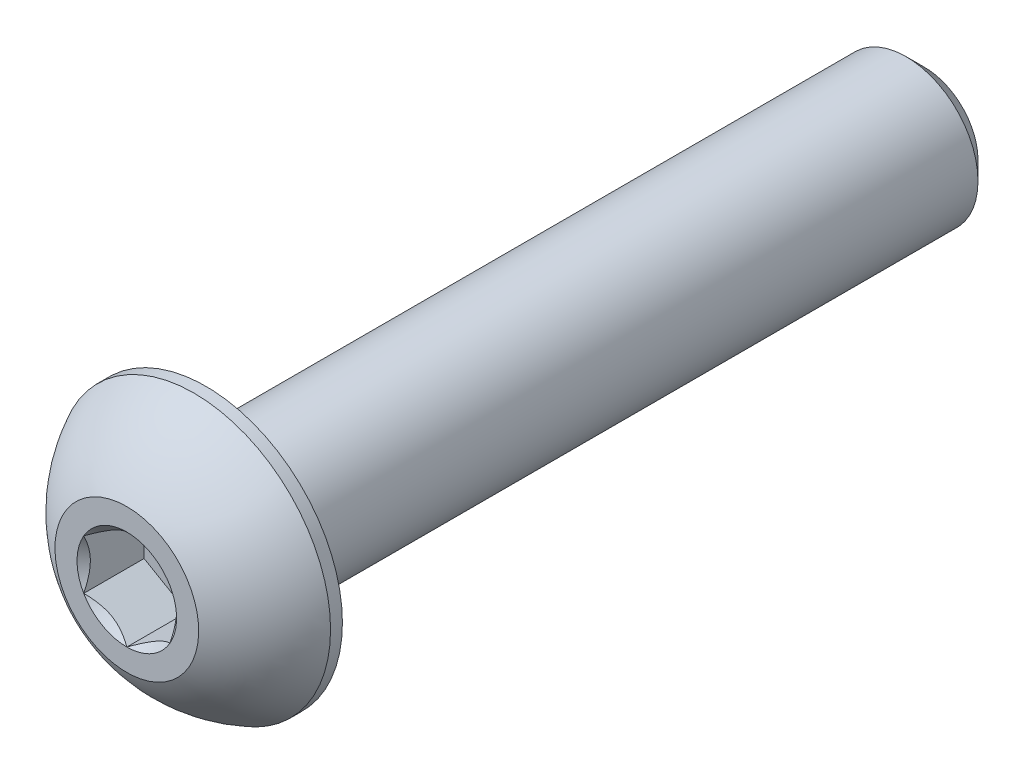
ISO-10303-21;
HEADER;
FILE_DESCRIPTION(('STEP AP214'),'2;1');
FILE_NAME('part.step','',(''),(''),'','','');
FILE_SCHEMA(('AUTOMOTIVE_DESIGN { 1 0 10303 214 1 1 1 1 }'));
ENDSEC;
DATA;
#1=APPLICATION_CONTEXT('core data for automotive mechanical design processes');
#2=APPLICATION_PROTOCOL_DEFINITION('international standard','automotive_design',2000,#1);
#3=PRODUCT_CONTEXT('',#1,'mechanical');
#4=PRODUCT('Part','Part','',(#3));
#5=PRODUCT_RELATED_PRODUCT_CATEGORY('part','',(#4));
#6=PRODUCT_DEFINITION_FORMATION('','',#4);
#7=PRODUCT_DEFINITION_CONTEXT('part definition',#1,'design');
#8=PRODUCT_DEFINITION('design','',#6,#7);
#9=PRODUCT_DEFINITION_SHAPE('','',#8);
#10=(LENGTH_UNIT() NAMED_UNIT(*) SI_UNIT(.MILLI.,.METRE.));
#11=(NAMED_UNIT(*) PLANE_ANGLE_UNIT() SI_UNIT($,.RADIAN.));
#12=(NAMED_UNIT(*) SI_UNIT($,.STERADIAN.) SOLID_ANGLE_UNIT());
#13=UNCERTAINTY_MEASURE_WITH_UNIT(LENGTH_MEASURE(1.E-05),#10,'distance_accuracy_value','');
#14=(GEOMETRIC_REPRESENTATION_CONTEXT(3) GLOBAL_UNCERTAINTY_ASSIGNED_CONTEXT((#13)) GLOBAL_UNIT_ASSIGNED_CONTEXT((#10,
#11,#12)) REPRESENTATION_CONTEXT('',''));
#15=CARTESIAN_POINT('',(0.,0.,0.));
#16=DIRECTION('',(0.,0.,1.));
#17=DIRECTION('',(1.,0.,0.));
#18=AXIS2_PLACEMENT_3D('',#15,#16,#17);
#19=CARTESIAN_POINT('',(0.,0.,13.875));
#20=DIRECTION('',(0.,0.,-1.));
#21=DIRECTION('',(-1.,0.,0.));
#22=AXIS2_PLACEMENT_3D('',#19,#20,#21);
#23=PLANE('',#22);
#24=CARTESIAN_POINT('',(0.,0.,13.875));
#25=DIRECTION('',(0.,0.,1.));
#26=DIRECTION('',(1.,0.,0.));
#27=AXIS2_PLACEMENT_3D('',#24,#25,#26);
#28=CIRCLE('',#27,1.73205080756888);
#29=CARTESIAN_POINT('',(-1.5,0.86602540378444,13.875));
#30=VERTEX_POINT('',#29);
#31=CARTESIAN_POINT('',(-1.5,-0.866025403784439,13.875));
#32=VERTEX_POINT('',#31);
#33=EDGE_CURVE('E138',#30,#32,#28,.T.);
#34=ORIENTED_EDGE('',*,*,#33,.F.);
#35=CARTESIAN_POINT('',(0.,1.73205080756888,13.875));
#36=VERTEX_POINT('',#35);
#37=EDGE_CURVE('E108',#36,#30,#28,.T.);
#38=ORIENTED_EDGE('',*,*,#37,.F.);
#39=CARTESIAN_POINT('',(1.5,0.866025403784439,13.875));
#40=VERTEX_POINT('',#39);
#41=EDGE_CURVE('E98',#40,#36,#28,.T.);
#42=ORIENTED_EDGE('',*,*,#41,.F.);
#43=CARTESIAN_POINT('',(1.5,-0.866025403784438,13.875));
#44=VERTEX_POINT('',#43);
#45=EDGE_CURVE('E59',#44,#40,#28,.T.);
#46=ORIENTED_EDGE('',*,*,#45,.F.);
#47=CARTESIAN_POINT('',(0.,-1.73205080756888,13.875));
#48=VERTEX_POINT('',#47);
#49=EDGE_CURVE('E66',#48,#44,#28,.T.);
#50=ORIENTED_EDGE('',*,*,#49,.F.);
#51=EDGE_CURVE('E141',#32,#48,#28,.T.);
#52=ORIENTED_EDGE('',*,*,#51,.F.);
#53=EDGE_LOOP('',(#34,#38,#42,#46,#50,#52));
#54=FACE_BOUND('',#53,.T.);
#55=CARTESIAN_POINT('',(0.,0.,13.875));
#56=DIRECTION('',(0.,0.,1.));
#57=DIRECTION('',(1.,0.,0.));
#58=AXIS2_PLACEMENT_3D('',#55,#56,#57);
#59=CIRCLE('',#58,2.49999999999999);
#60=CARTESIAN_POINT('',(0.,2.5,13.875));
#61=VERTEX_POINT('',#60);
#62=EDGE_CURVE('E53',#61,#61,#59,.T.);
#63=ORIENTED_EDGE('',*,*,#62,.T.);
#64=EDGE_LOOP('',(#63));
#65=FACE_BOUND('',#64,.T.);
#66=ADVANCED_FACE('F39',(#54,#65),#23,.F.);
#67=CARTESIAN_POINT('',(0.,0.,9.21694518716577));
#68=DIRECTION('',(0.,0.,1.));
#69=DIRECTION('',(0.,1.,0.));
#70=AXIS2_PLACEMENT_3D('',#67,#68,#69);
#71=SPHERICAL_SURFACE('',#70,5.28653711226622);
#72=CARTESIAN_POINT('',(0.,0.,11.5375));
#73=DIRECTION('',(0.,0.,1.));
#74=DIRECTION('',(1.,0.,0.));
#75=AXIS2_PLACEMENT_3D('',#72,#73,#74);
#76=CIRCLE('',#75,4.75);
#77=CARTESIAN_POINT('',(0.,4.75,11.5375));
#78=VERTEX_POINT('',#77);
#79=EDGE_CURVE('E239',#78,#78,#76,.T.);
#80=CARTESIAN_POINT('',(0.,2.5,13.875));
#81=CARTESIAN_POINT('',(0.,2.53026679982017,13.8587557175444));
#82=CARTESIAN_POINT('',(0.,2.56037522904967,13.8422163587936));
#83=CARTESIAN_POINT('',(0.,2.62026400427657,13.8085539481178));
#84=CARTESIAN_POINT('',(0.,2.65004435027396,13.7914308961928));
#85=CARTESIAN_POINT('',(0.,2.70926561698583,13.756607558585));
#86=CARTESIAN_POINT('',(0.,2.73870653770032,13.7389072729021));
#87=CARTESIAN_POINT('',(0.,2.79723777417103,13.7029362059551));
#88=CARTESIAN_POINT('',(0.,2.82632808992725,13.684665424691));
#89=CARTESIAN_POINT('',(0.,2.88414706107589,13.6475603056073));
#90=CARTESIAN_POINT('',(0.,2.91287571646831,13.6287259677878));
#91=CARTESIAN_POINT('',(0.,2.96996045130293,13.5905008930214));
#92=CARTESIAN_POINT('',(0.,2.99831653074514,13.5711101560746));
#93=CARTESIAN_POINT('',(0.,3.05464533901891,13.5317796507551));
#94=CARTESIAN_POINT('',(0.,3.08261806785047,13.5118398823824));
#95=CARTESIAN_POINT('',(0.,3.13816954607726,13.4714188908354));
#96=CARTESIAN_POINT('',(0.,3.1657482954725,13.4509376676611));
#97=CARTESIAN_POINT('',(0.,3.22050133565614,13.409441548791));
#98=CARTESIAN_POINT('',(0.,3.24767562644455,13.3884266530951));
#99=CARTESIAN_POINT('',(0.,3.30160942393942,13.3458711742648));
#100=CARTESIAN_POINT('',(0.,3.32836893064588,13.3243305911303));
#101=CARTESIAN_POINT('',(0.,3.38146299210494,13.2807319222463));
#102=CARTESIAN_POINT('',(0.,3.40779754685753,13.2586738364968));
#103=CARTESIAN_POINT('',(0.,3.46003169800773,13.2140485438445));
#104=CARTESIAN_POINT('',(0.,3.48593129440535,13.1914813369418));
#105=CARTESIAN_POINT('',(0.,3.53728568771641,13.1458463768965));
#106=CARTESIAN_POINT('',(0.,3.56274048462986,13.1227786237539));
#107=CARTESIAN_POINT('',(0.,3.61319560685493,13.0761513363362));
#108=CARTESIAN_POINT('',(0.,3.63819593216655,13.052591802061));
#109=CARTESIAN_POINT('',(0.,3.68773261175691,13.0049899043484));
#110=CARTESIAN_POINT('',(0.,3.71226896603565,12.980947540911));
#111=CARTESIAN_POINT('',(0.,3.76086838042534,12.9323891203059));
#112=CARTESIAN_POINT('',(0.,3.78493144053629,12.9078730631382));
#113=CARTESIAN_POINT('',(0.,3.83257512329416,12.8583765704953));
#114=CARTESIAN_POINT('',(0.,3.85615574594108,12.8333961350201));
#115=CARTESIAN_POINT('',(0.,3.90282559378753,12.7829803776354));
#116=CARTESIAN_POINT('',(0.,3.92591481898706,12.757545055726));
#117=CARTESIAN_POINT('',(0.,3.97159309867276,12.7062291901907));
#118=CARTESIAN_POINT('',(0.,3.99418215315894,12.6803486465648));
#119=CARTESIAN_POINT('',(0.,4.03885150820303,12.6281521714863));
#120=CARTESIAN_POINT('',(0.,4.06093180876093,12.6018362400336));
#121=CARTESIAN_POINT('',(0.,4.10457526604591,12.5487789886263));
#122=CARTESIAN_POINT('',(0.,4.12613842277298,12.5220376686717));
#123=CARTESIAN_POINT('',(0.,4.16873939899417,12.4681398012215));
#124=CARTESIAN_POINT('',(0.,4.1897772184883,12.4409832537258));
#125=CARTESIAN_POINT('',(0.,4.23131952645464,12.386265249929));
#126=CARTESIAN_POINT('',(0.,4.25182401492686,12.3587037936279));
#127=CARTESIAN_POINT('',(0.,4.29229186971308,12.3031864448106));
#128=CARTESIAN_POINT('',(0.,4.31225523602708,12.2752305522945));
#129=CARTESIAN_POINT('',(0.,4.35163326096594,12.2189349535096));
#130=CARTESIAN_POINT('',(0.,4.3710479195908,12.1905952472408));
#131=CARTESIAN_POINT('',(0.,4.40932115213664,12.1335427892629));
#132=CARTESIAN_POINT('',(0.,4.42817972605763,12.1048300375538));
#133=CARTESIAN_POINT('',(0.,4.46533362339398,12.0470423987117));
#134=CARTESIAN_POINT('',(0.,4.48362894680934,12.0179675115786));
#135=CARTESIAN_POINT('',(0.,4.51964939166499,11.9594666496668));
#136=CARTESIAN_POINT('',(0.,4.53737451310527,11.9300406748879));
#137=CARTESIAN_POINT('',(0.,4.57224781803529,11.8708488182676));
#138=CARTESIAN_POINT('',(0.,4.58939600152503,11.8410829364262));
#139=CARTESIAN_POINT('',(0.,4.62310891815402,11.7812225776529));
#140=CARTESIAN_POINT('',(0.,4.63967365129327,11.7511281007211));
#141=CARTESIAN_POINT('',(0.,4.67221336026297,11.6906219802598));
#142=CARTESIAN_POINT('',(0.,4.68818833609342,11.6602103367303));
#143=CARTESIAN_POINT('',(0.,4.71954250823692,11.5990814631935));
#144=CARTESIAN_POINT('',(0.,4.73492170454996,11.5683642331862));
#145=CARTESIAN_POINT('',(0.,4.75,11.5375));
#146=B_SPLINE_CURVE_WITH_KNOTS('',3,(#80,#81,#82,#83,#84,#85,#86,#87,#88,#89,#90,#91,#92,#93,
#94,#95,#96,#97,#98,#99,#100,#101,#102,#103,#104,#105,#106,#107,#108,#109,#110,#111,#112,#113,
#114,#115,#116,#117,#118,#119,#120,#121,#122,#123,#124,#125,#126,#127,#128,#129,#130,#131,#132,
#133,#134,#135,#136,#137,#138,#139,#140,#141,#142,#143,#144,#145),.UNSPECIFIED.,.F.,.F.,(4,2,2,
2,2,2,2,2,2,2,2,2,2,2,2,2,2,2,2,2,2,2,2,2,2,2,2,2,2,2,2,2,4),(0.,0.10304982363783,
0.206099647275662,0.309149470913491,0.412199294551322,0.515249118189152,0.618298941826984,
0.721348765464813,0.824398589102644,0.927448412740474,1.0304982363783,1.13354806001614,
1.23659788365397,1.3396477072918,1.44269753092963,1.54574735456746,1.64879717820529,
1.75184700184312,1.85489682548095,1.95794664911878,2.06099647275661,2.16404629639444,
2.26709612003227,2.3701459436701,2.47319576730793,2.57624559094576,2.67929541458359,
2.78234523822142,2.88539506185925,2.98844488549708,3.09149470913491,3.19454453277274,
3.29759435641057),.UNSPECIFIED.);
#147=EDGE_CURVE('BSEAM246',#61,#78,#146,.T.);
#148=ORIENTED_EDGE('',*,*,#62,.F.);
#149=ORIENTED_EDGE('',*,*,#79,.T.);
#150=ORIENTED_EDGE('',*,*,#147,.T.);
#151=ORIENTED_EDGE('',*,*,#147,.F.);
#152=EDGE_LOOP('',(#148,#150,#149,#151));
#153=FACE_BOUND('',#152,.T.);
#154=ADVANCED_FACE('F246',(#153),#71,.T.);
#155=CARTESIAN_POINT('',(0.,0.,13.875));
#156=DIRECTION('',(0.,0.,1.));
#157=DIRECTION('',(1.,0.,0.));
#158=AXIS2_PLACEMENT_3D('',#155,#156,#157);
#159=CYLINDRICAL_SURFACE('',#158,4.75);
#160=ORIENTED_EDGE('',*,*,#79,.F.);
#161=EDGE_LOOP('',(#160));
#162=FACE_BOUND('',#161,.T.);
#163=CARTESIAN_POINT('',(0.,0.,11.125));
#164=DIRECTION('',(0.,0.,1.));
#165=DIRECTION('',(1.,0.,0.));
#166=AXIS2_PLACEMENT_3D('',#163,#164,#165);
#167=CIRCLE('',#166,4.75);
#168=CARTESIAN_POINT('',(4.75,0.,11.125));
#169=VERTEX_POINT('',#168);
#170=EDGE_CURVE('E235',#169,#169,#167,.T.);
#171=ORIENTED_EDGE('',*,*,#170,.T.);
#172=EDGE_LOOP('',(#171));
#173=FACE_BOUND('',#172,.T.);
#174=ADVANCED_FACE('F249',(#162,#173),#159,.T.);
#175=CARTESIAN_POINT('',(0.,2.49999999999999,11.125));
#176=DIRECTION('',(0.,0.,1.));
#177=DIRECTION('',(1.,0.,0.));
#178=AXIS2_PLACEMENT_3D('',#175,#176,#177);
#179=PLANE('',#178);
#180=ORIENTED_EDGE('',*,*,#170,.F.);
#181=EDGE_LOOP('',(#180));
#182=FACE_BOUND('',#181,.T.);
#183=CARTESIAN_POINT('',(0.,0.,11.125));
#184=DIRECTION('',(0.,0.,1.));
#185=DIRECTION('',(1.,0.,0.));
#186=AXIS2_PLACEMENT_3D('',#183,#184,#185);
#187=CIRCLE('',#186,2.49999999999999);
#188=CARTESIAN_POINT('',(2.49999999999999,0.,11.125));
#189=VERTEX_POINT('',#188);
#190=EDGE_CURVE('E231',#189,#189,#187,.T.);
#191=ORIENTED_EDGE('',*,*,#190,.T.);
#192=EDGE_LOOP('',(#191));
#193=FACE_BOUND('',#192,.T.);
#194=ADVANCED_FACE('F254',(#182,#193),#179,.F.);
#195=CARTESIAN_POINT('',(0.,0.,13.875));
#196=DIRECTION('',(0.,0.,1.));
#197=DIRECTION('',(1.,0.,0.));
#198=AXIS2_PLACEMENT_3D('',#195,#196,#197);
#199=CYLINDRICAL_SURFACE('',#198,2.49999999999999);
#200=ORIENTED_EDGE('',*,*,#190,.F.);
#201=EDGE_LOOP('',(#200));
#202=FACE_BOUND('',#201,.T.);
#203=CARTESIAN_POINT('',(0.,0.,-13.235));
#204=DIRECTION('',(0.,0.,1.));
#205=DIRECTION('',(1.,0.,0.));
#206=AXIS2_PLACEMENT_3D('',#203,#204,#205);
#207=CIRCLE('',#206,2.49999999999999);
#208=CARTESIAN_POINT('',(2.49999999999999,0.,-13.235));
#209=VERTEX_POINT('',#208);
#210=EDGE_CURVE('E227',#209,#209,#207,.T.);
#211=ORIENTED_EDGE('',*,*,#210,.T.);
#212=EDGE_LOOP('',(#211));
#213=FACE_BOUND('',#212,.T.);
#214=ADVANCED_FACE('F260',(#202,#213),#199,.T.);
#215=CARTESIAN_POINT('',(0.,0.,-13.875));
#216=DIRECTION('',(0.,0.,1.));
#217=DIRECTION('',(1.,0.,0.));
#218=AXIS2_PLACEMENT_3D('',#215,#216,#217);
#219=CONICAL_SURFACE('',#218,1.86,0.785398163397444);
#220=ORIENTED_EDGE('',*,*,#210,.F.);
#221=EDGE_LOOP('',(#220));
#222=FACE_BOUND('',#221,.T.);
#223=CARTESIAN_POINT('',(0.,0.,-13.875));
#224=DIRECTION('',(0.,0.,1.));
#225=DIRECTION('',(1.,0.,0.));
#226=AXIS2_PLACEMENT_3D('',#223,#224,#225);
#227=CIRCLE('',#226,1.86);
#228=CARTESIAN_POINT('',(1.86,0.,-13.875));
#229=VERTEX_POINT('',#228);
#230=EDGE_CURVE('E209',#229,#229,#227,.T.);
#231=ORIENTED_EDGE('',*,*,#230,.T.);
#232=EDGE_LOOP('',(#231));
#233=FACE_BOUND('',#232,.T.);
#234=ADVANCED_FACE('F266',(#222,#233),#219,.T.);
#235=CARTESIAN_POINT('',(0.,0.,-13.875));
#236=DIRECTION('',(0.,0.,1.));
#237=DIRECTION('',(1.,0.,0.));
#238=AXIS2_PLACEMENT_3D('',#235,#236,#237);
#239=PLANE('',#238);
#240=ORIENTED_EDGE('',*,*,#230,.F.);
#241=EDGE_LOOP('',(#240));
#242=FACE_BOUND('',#241,.T.);
#243=ADVANCED_FACE('F175',(#242),#239,.F.);
#244=CARTESIAN_POINT('',(0.,0.,13.875));
#245=DIRECTION('',(0.,0.,1.));
#246=DIRECTION('',(1.,0.,0.));
#247=AXIS2_PLACEMENT_3D('',#244,#245,#246);
#248=CONICAL_SURFACE('',#247,1.73205080756888,0.78539816339745);
#249=ORIENTED_EDGE('',*,*,#37,.T.);
#250=CARTESIAN_POINT('',(0.000200000000000348,1.73216627762272,13.8751154816001));
#251=CARTESIAN_POINT('',(-0.0513677907370757,1.70239359975915,13.8453654760673));
#252=CARTESIAN_POINT('',(-0.103797917665201,1.67212305186355,13.8173624839103));
#253=CARTESIAN_POINT('',(-0.210709034055597,1.61039789003619,13.7660892304401));
#254=CARTESIAN_POINT('',(-0.265200195814661,1.57893740312614,13.7428475050444));
#255=CARTESIAN_POINT('',(-0.375079081357248,1.51549879897987,13.7030337289922));
#256=CARTESIAN_POINT('',(-0.4304388090952,1.4835368452681,13.6863615856709));
#257=CARTESIAN_POINT('',(-0.542377257477151,1.41890915196211,13.6606744568181));
#258=CARTESIAN_POINT('',(-0.598952556553008,1.38624538781118,13.6516402904789));
#259=CARTESIAN_POINT('',(-0.696455389516441,1.329952100953,13.6434890812269));
#260=CARTESIAN_POINT('',(-0.737256908280466,1.30639533311124,13.6422822529892));
#261=CARTESIAN_POINT('',(-0.818787969615858,1.25932335290194,13.6443140571623));
#262=CARTESIAN_POINT('',(-0.85951749431463,1.23580815085313,13.6475536707483));
#263=CARTESIAN_POINT('',(-0.940584402163416,1.18900414978427,13.658291985982));
#264=CARTESIAN_POINT('',(-0.980921384598288,1.1657155821172,13.6657946530187));
#265=CARTESIAN_POINT('',(-1.06091833691403,1.11952932016335,13.6846516119283));
#266=CARTESIAN_POINT('',(-1.10057800851621,1.09663179808786,13.6960075570186));
#267=CARTESIAN_POINT('',(-1.20216313477449,1.03798159809698,13.7297216475927));
#268=CARTESIAN_POINT('',(-1.26345855370969,1.00259267147465,13.7546218490934));
#269=CARTESIAN_POINT('',(-1.35358562846331,0.950557780604375,13.7966566532716));
#270=CARTESIAN_POINT('',(-1.38328513990772,0.933410759677148,13.8114251535591));
#271=CARTESIAN_POINT('',(-1.44213790138375,0.899432101996407,13.8423105659402));
#272=CARTESIAN_POINT('',(-1.47129140422064,0.882600319285711,13.8584268341217));
#273=CARTESIAN_POINT('',(-1.5002,0.865909933730602,13.8751154816001));
#274=B_SPLINE_CURVE_WITH_KNOTS('',3,(#250,#251,#252,#253,#254,#255,#256,#257,#258,#259,#260,
#261,#262,#263,#264,#265,#266,#267,#268,#269,#270,#271,#272,#273),.UNSPECIFIED.,.F.,.F.,(4,2,2,
2,2,2,2,2,2,2,2,4),(0.,0.199829143693305,0.400822987382389,0.598623720538181,0.795926240188889,
0.937113067959881,1.07833105577193,1.21968061668222,1.36109089931054,1.58570969637566,
1.69770705470964,1.80965120737194),.UNSPECIFIED.);
#275=EDGE_CURVE('E11',#36,#30,#274,.T.);
#276=ORIENTED_EDGE('',*,*,#275,.F.);
#277=EDGE_LOOP('',(#249,#276));
#278=FACE_BOUND('',#277,.T.);
#279=ADVANCED_FACE('F112',(#278),#248,.F.);
#280=ORIENTED_EDGE('',*,*,#33,.T.);
#281=CARTESIAN_POINT('',(-1.5,-1.72720812969692,14.4305785162708));
#282=CARTESIAN_POINT('',(-1.5,-1.68515175699268,14.3988299078574));
#283=CARTESIAN_POINT('',(-1.5,-1.64286104748673,14.3673925938074));
#284=CARTESIAN_POINT('',(-1.5,-1.55771581035942,14.3052690875564));
#285=CARTESIAN_POINT('',(-1.5,-1.51486114386668,14.2745830858922));
#286=CARTESIAN_POINT('',(-1.5,-1.3846813415127,14.1834071924272));
#287=CARTESIAN_POINT('',(-1.5,-1.29637976071653,14.1242883434268));
#288=CARTESIAN_POINT('',(-1.5,-1.11121478730467,14.0082309963165));
#289=CARTESIAN_POINT('',(-1.5,-1.01415038238167,13.951609558733));
#290=CARTESIAN_POINT('',(-1.5,-0.815173408897604,13.8480368812657));
#291=CARTESIAN_POINT('',(-1.5,-0.713278669253284,13.8010530415417));
#292=CARTESIAN_POINT('',(-1.5,-0.560333774943111,13.7435726684308));
#293=CARTESIAN_POINT('',(-1.5,-0.511547982948041,13.7270753877572));
#294=CARTESIAN_POINT('',(-1.5,-0.412798620136866,13.697997512927));
#295=CARTESIAN_POINT('',(-1.5,-0.362834968437562,13.685417188594));
#296=CARTESIAN_POINT('',(-1.5,-0.262863235444981,13.6650361941468));
#297=CARTESIAN_POINT('',(-1.5,-0.212872113808022,13.657153632746));
#298=CARTESIAN_POINT('',(-1.5,-0.112355243569545,13.646322063969));
#299=CARTESIAN_POINT('',(-1.5,-0.0618295883726279,13.6433722085244));
#300=CARTESIAN_POINT('',(-1.5,0.0374291733323841,13.6426248577249));
#301=CARTESIAN_POINT('',(-1.5,0.0861609672002991,13.6446447335581));
#302=CARTESIAN_POINT('',(-1.5,0.183206937768827,13.6533225528968));
#303=CARTESIAN_POINT('',(-1.5,0.231521073438269,13.6599809469685));
#304=CARTESIAN_POINT('',(-1.5,0.328199853425436,13.6776852441226));
#305=CARTESIAN_POINT('',(-1.5,0.376550616310328,13.688805811257));
#306=CARTESIAN_POINT('',(-1.5,0.472195697125598,13.7148434140487));
#307=CARTESIAN_POINT('',(-1.5,0.519490103092741,13.7297601320409));
#308=CARTESIAN_POINT('',(-1.5,0.668391282696625,13.7823352235961));
#309=CARTESIAN_POINT('',(-1.5,0.767878709508553,13.825981287472));
#310=CARTESIAN_POINT('',(-1.5,0.962179866690724,13.9230229945931));
#311=CARTESIAN_POINT('',(-1.5,1.05697519961444,13.9764536650895));
#312=CARTESIAN_POINT('',(-1.5,1.23814273533383,14.0866858520046));
#313=CARTESIAN_POINT('',(-1.5,1.3246994218129,14.1431879206986));
#314=CARTESIAN_POINT('',(-1.5,1.45222331290673,14.2305343015787));
#315=CARTESIAN_POINT('',(-1.5,1.49418091978756,14.25995775868));
#316=CARTESIAN_POINT('',(-1.5,1.57752272931476,14.3195828218305));
#317=CARTESIAN_POINT('',(-1.5,1.61890708647354,14.3497842116644));
#318=CARTESIAN_POINT('',(-1.5,1.66005278019494,14.3803081786095));
#319=B_SPLINE_CURVE_WITH_KNOTS('',3,(#281,#282,#283,#284,#285,#286,#287,#288,#289,#290,#291,
#292,#293,#294,#295,#296,#297,#298,#299,#300,#301,#302,#303,#304,#305,#306,#307,#308,#309,#310,
#311,#312,#313,#314,#315,#316,#317,#318),.UNSPECIFIED.,.F.,.F.,(4,2,2,2,2,2,2,2,2,2,2,2,2,2,2,2,
2,2,4),(0.,0.158079548982669,0.316198780993942,0.63485041734696,0.971690311361511,
1.30737131660667,1.46173961127089,1.61611853740677,1.7677210142141,1.91929742368538,
2.065387412096,2.21149159305544,2.36014984633872,2.50879566386709,2.83376031422673,
3.15991186985652,3.46985601802198,3.62358896039974,3.77727962642071),.UNSPECIFIED.);
#320=EDGE_CURVE('E107',#30,#32,#319,.F.);
#321=ORIENTED_EDGE('',*,*,#320,.F.);
#322=EDGE_LOOP('',(#280,#321));
#323=FACE_BOUND('',#322,.T.);
#324=ADVANCED_FACE('F278',(#323),#248,.F.);
#325=ORIENTED_EDGE('',*,*,#51,.T.);
#326=CARTESIAN_POINT('',(-1.5002,-0.8659099337306,13.8751154816001));
#327=CARTESIAN_POINT('',(-1.44863220926292,-0.895682611594165,13.8453654760673));
#328=CARTESIAN_POINT('',(-1.3962020823348,-0.925953159489764,13.8173624839103));
#329=CARTESIAN_POINT('',(-1.2892909659444,-0.987678321317123,13.7660892304401));
#330=CARTESIAN_POINT('',(-1.23479980418534,-1.01913880822717,13.7428475050444));
#331=CARTESIAN_POINT('',(-1.12492091864275,-1.08257741237344,13.7030337289922));
#332=CARTESIAN_POINT('',(-1.0695611909048,-1.11453936608521,13.6863615856709));
#333=CARTESIAN_POINT('',(-0.957622742522849,-1.1791670593912,13.6606744568181));
#334=CARTESIAN_POINT('',(-0.901047443446992,-1.21183082354213,13.6516402904789));
#335=CARTESIAN_POINT('',(-0.803544610483559,-1.26812411040032,13.6434890812268));
#336=CARTESIAN_POINT('',(-0.762743091719534,-1.29168087824208,13.6422822529892));
#337=CARTESIAN_POINT('',(-0.681212030384142,-1.33875285845138,13.6443140571623));
#338=CARTESIAN_POINT('',(-0.64048250568537,-1.36226806050018,13.6475536707483));
#339=CARTESIAN_POINT('',(-0.559415597836584,-1.40907206156905,13.658291985982));
#340=CARTESIAN_POINT('',(-0.519078615401712,-1.43236062923612,13.6657946530187));
#341=CARTESIAN_POINT('',(-0.439081663085969,-1.47854689118996,13.6846516119283));
#342=CARTESIAN_POINT('',(-0.399421991483792,-1.50144441326545,13.6960075570186));
#343=CARTESIAN_POINT('',(-0.297836865225515,-1.56009461325633,13.7297216475927));
#344=CARTESIAN_POINT('',(-0.236541446290311,-1.59548353987866,13.7546218490934));
#345=CARTESIAN_POINT('',(-0.146414371536687,-1.64751843074894,13.7966566532716));
#346=CARTESIAN_POINT('',(-0.116714860092283,-1.66466545167617,13.8114251535591));
#347=CARTESIAN_POINT('',(-0.0578620986162495,-1.69864410935691,13.8423105659402));
#348=CARTESIAN_POINT('',(-0.0287085957793633,-1.71547589206761,13.8584268341217));
#349=CARTESIAN_POINT('',(0.000199999999999423,-1.73216627762271,13.8751154816001));
#350=B_SPLINE_CURVE_WITH_KNOTS('',3,(#326,#327,#328,#329,#330,#331,#332,#333,#334,#335,#336,
#337,#338,#339,#340,#341,#342,#343,#344,#345,#346,#347,#348,#349),.UNSPECIFIED.,.F.,.F.,(4,2,2,
2,2,2,2,2,2,2,2,4),(0.,0.199829143693304,0.400822987382389,0.598623720538181,0.795926240188889,
0.937113067959881,1.07833105577193,1.21968061668222,1.36109089931054,1.58570969637565,
1.69770705470964,1.80965120737194),.UNSPECIFIED.);
#351=EDGE_CURVE('E151',#32,#48,#350,.T.);
#352=ORIENTED_EDGE('',*,*,#351,.F.);
#353=EDGE_LOOP('',(#325,#352));
#354=FACE_BOUND('',#353,.T.);
#355=ADVANCED_FACE('F386',(#354),#248,.F.);
#356=ORIENTED_EDGE('',*,*,#49,.T.);
#357=CARTESIAN_POINT('',(-0.000200000000000595,-1.73216627762271,13.8751154816001));
#358=CARTESIAN_POINT('',(0.0513677907370749,-1.70239359975915,13.8453654760673));
#359=CARTESIAN_POINT('',(0.1037979176652,-1.67212305186355,13.8173624839103));
#360=CARTESIAN_POINT('',(0.210709034055596,-1.61039789003619,13.7660892304401));
#361=CARTESIAN_POINT('',(0.265200195814661,-1.57893740312614,13.7428475050444));
#362=CARTESIAN_POINT('',(0.375079081357248,-1.51549879897987,13.7030337289922));
#363=CARTESIAN_POINT('',(0.430438809095199,-1.4835368452681,13.6863615856709));
#364=CARTESIAN_POINT('',(0.54237725747715,-1.41890915196211,13.6606744568181));
#365=CARTESIAN_POINT('',(0.598952556553008,-1.38624538781118,13.6516402904789));
#366=CARTESIAN_POINT('',(0.69645538951644,-1.32995210095299,13.6434890812269));
#367=CARTESIAN_POINT('',(0.737256908280465,-1.30639533311124,13.6422822529892));
#368=CARTESIAN_POINT('',(0.818787969615857,-1.25932335290193,13.6443140571623));
#369=CARTESIAN_POINT('',(0.859517494314629,-1.23580815085313,13.6475536707483));
#370=CARTESIAN_POINT('',(0.940584402163415,-1.18900414978427,13.658291985982));
#371=CARTESIAN_POINT('',(0.980921384598287,-1.1657155821172,13.6657946530187));
#372=CARTESIAN_POINT('',(1.06091833691403,-1.11952932016335,13.6846516119283));
#373=CARTESIAN_POINT('',(1.10057800851621,-1.09663179808786,13.6960075570186));
#374=CARTESIAN_POINT('',(1.20216313477448,-1.03798159809698,13.7297216475927));
#375=CARTESIAN_POINT('',(1.26345855370969,-1.00259267147465,13.7546218490934));
#376=CARTESIAN_POINT('',(1.35358562846331,-0.950557780604375,13.7966566532716));
#377=CARTESIAN_POINT('',(1.38328513990772,-0.933410759677147,13.8114251535591));
#378=CARTESIAN_POINT('',(1.44213790138375,-0.899432101996407,13.8423105659402));
#379=CARTESIAN_POINT('',(1.47129140422064,-0.88260031928571,13.8584268341217));
#380=CARTESIAN_POINT('',(1.5002,-0.865909933730601,13.8751154816001));
#381=B_SPLINE_CURVE_WITH_KNOTS('',3,(#357,#358,#359,#360,#361,#362,#363,#364,#365,#366,#367,
#368,#369,#370,#371,#372,#373,#374,#375,#376,#377,#378,#379,#380),.UNSPECIFIED.,.F.,.F.,(4,2,2,
2,2,2,2,2,2,2,2,4),(0.,0.199829143693305,0.400822987382389,0.598623720538181,0.795926240188889,
0.93711306795988,1.07833105577193,1.21968061668222,1.36109089931054,1.58570969637565,
1.69770705470964,1.80965120737194),.UNSPECIFIED.);
#382=EDGE_CURVE('E369',#48,#44,#381,.T.);
#383=ORIENTED_EDGE('',*,*,#382,.F.);
#384=EDGE_LOOP('',(#356,#383));
#385=FACE_BOUND('',#384,.T.);
#386=ADVANCED_FACE('F387',(#385),#248,.F.);
#387=ORIENTED_EDGE('',*,*,#45,.T.);
#388=CARTESIAN_POINT('',(1.5,-1.72720812969692,14.4305785162708));
#389=CARTESIAN_POINT('',(1.5,-1.68515175699268,14.3988299078574));
#390=CARTESIAN_POINT('',(1.5,-1.64286104748674,14.3673925938074));
#391=CARTESIAN_POINT('',(1.5,-1.55771581035942,14.3052690875564));
#392=CARTESIAN_POINT('',(1.5,-1.51486114386668,14.2745830858922));
#393=CARTESIAN_POINT('',(1.5,-1.3846813415127,14.1834071924272));
#394=CARTESIAN_POINT('',(1.5,-1.29637976071654,14.1242883434268));
#395=CARTESIAN_POINT('',(1.5,-1.11121478730467,14.0082309963165));
#396=CARTESIAN_POINT('',(1.5,-1.01415038238167,13.951609558733));
#397=CARTESIAN_POINT('',(1.5,-0.815173408897605,13.8480368812657));
#398=CARTESIAN_POINT('',(1.5,-0.713278669253285,13.8010530415417));
#399=CARTESIAN_POINT('',(1.5,-0.560333774943111,13.7435726684308));
#400=CARTESIAN_POINT('',(1.5,-0.511547982948042,13.7270753877572));
#401=CARTESIAN_POINT('',(1.5,-0.412798620136867,13.697997512927));
#402=CARTESIAN_POINT('',(1.5,-0.362834968437563,13.685417188594));
#403=CARTESIAN_POINT('',(1.5,-0.262863235444982,13.6650361941468));
#404=CARTESIAN_POINT('',(1.5,-0.212872113808023,13.657153632746));
#405=CARTESIAN_POINT('',(1.5,-0.112355243569546,13.646322063969));
#406=CARTESIAN_POINT('',(1.5,-0.0618295883726285,13.6433722085244));
#407=CARTESIAN_POINT('',(1.5,0.0374291733323836,13.6426248577249));
#408=CARTESIAN_POINT('',(1.5,0.0861609672002986,13.6446447335581));
#409=CARTESIAN_POINT('',(1.5,0.183206937768827,13.6533225528968));
#410=CARTESIAN_POINT('',(1.5,0.231521073438269,13.6599809469685));
#411=CARTESIAN_POINT('',(1.5,0.328199853425435,13.6776852441226));
#412=CARTESIAN_POINT('',(1.5,0.376550616310328,13.688805811257));
#413=CARTESIAN_POINT('',(1.5,0.472195697125598,13.7148434140487));
#414=CARTESIAN_POINT('',(1.5,0.51949010309274,13.7297601320409));
#415=CARTESIAN_POINT('',(1.5,0.668391282696624,13.7823352235961));
#416=CARTESIAN_POINT('',(1.5,0.767878709508552,13.825981287472));
#417=CARTESIAN_POINT('',(1.5,0.962179866690724,13.9230229945931));
#418=CARTESIAN_POINT('',(1.5,1.05697519961444,13.9764536650895));
#419=CARTESIAN_POINT('',(1.5,1.23814273533383,14.0866858520046));
#420=CARTESIAN_POINT('',(1.5,1.3246994218129,14.1431879206986));
#421=CARTESIAN_POINT('',(1.5,1.45222331290673,14.2305343015787));
#422=CARTESIAN_POINT('',(1.5,1.49418091978756,14.25995775868));
#423=CARTESIAN_POINT('',(1.5,1.57752272931476,14.3195828218305));
#424=CARTESIAN_POINT('',(1.5,1.61890708647354,14.3497842116644));
#425=CARTESIAN_POINT('',(1.5,1.66005278019494,14.3803081786095));
#426=B_SPLINE_CURVE_WITH_KNOTS('',3,(#388,#389,#390,#391,#392,#393,#394,#395,#396,#397,#398,
#399,#400,#401,#402,#403,#404,#405,#406,#407,#408,#409,#410,#411,#412,#413,#414,#415,#416,#417,
#418,#419,#420,#421,#422,#423,#424,#425),.UNSPECIFIED.,.F.,.F.,(4,2,2,2,2,2,2,2,2,2,2,2,2,2,2,2,
2,2,4),(0.,0.158079548982668,0.316198780993942,0.634850417346959,0.971690311361511,
1.30737131660667,1.46173961127089,1.61611853740677,1.76772101421409,1.91929742368538,
2.065387412096,2.21149159305544,2.36014984633872,2.50879566386709,2.83376031422673,
3.15991186985652,3.46985601802197,3.62358896039974,3.77727962642071),.UNSPECIFIED.);
#427=EDGE_CURVE('E125',#44,#40,#426,.T.);
#428=ORIENTED_EDGE('',*,*,#427,.F.);
#429=EDGE_LOOP('',(#387,#428));
#430=FACE_BOUND('',#429,.T.);
#431=ADVANCED_FACE('F389',(#430),#248,.F.);
#432=ORIENTED_EDGE('',*,*,#41,.T.);
#433=CARTESIAN_POINT('',(1.5002,0.865909933730602,13.8751154816001));
#434=CARTESIAN_POINT('',(1.44863220926292,0.895682611594167,13.8453654760673));
#435=CARTESIAN_POINT('',(1.3962020823348,0.925953159489766,13.8173624839103));
#436=CARTESIAN_POINT('',(1.2892909659444,0.987678321317124,13.7660892304401));
#437=CARTESIAN_POINT('',(1.23479980418534,1.01913880822718,13.7428475050444));
#438=CARTESIAN_POINT('',(1.12492091864275,1.08257741237344,13.7030337289922));
#439=CARTESIAN_POINT('',(1.0695611909048,1.11453936608521,13.6863615856709));
#440=CARTESIAN_POINT('',(0.957622742522849,1.1791670593912,13.6606744568181));
#441=CARTESIAN_POINT('',(0.901047443446991,1.21183082354213,13.6516402904789));
#442=CARTESIAN_POINT('',(0.803544610483559,1.26812411040032,13.6434890812269));
#443=CARTESIAN_POINT('',(0.762743091719533,1.29168087824208,13.6422822529892));
#444=CARTESIAN_POINT('',(0.681212030384141,1.33875285845138,13.6443140571623));
#445=CARTESIAN_POINT('',(0.64048250568537,1.36226806050018,13.6475536707483));
#446=CARTESIAN_POINT('',(0.559415597836583,1.40907206156905,13.658291985982));
#447=CARTESIAN_POINT('',(0.519078615401711,1.43236062923612,13.6657946530187));
#448=CARTESIAN_POINT('',(0.439081663085969,1.47854689118997,13.6846516119283));
#449=CARTESIAN_POINT('',(0.399421991483792,1.50144441326545,13.6960075570186));
#450=CARTESIAN_POINT('',(0.297836865225515,1.56009461325633,13.7297216475927));
#451=CARTESIAN_POINT('',(0.236541446290311,1.59548353987866,13.7546218490934));
#452=CARTESIAN_POINT('',(0.146414371536686,1.64751843074894,13.7966566532716));
#453=CARTESIAN_POINT('',(0.116714860092282,1.66466545167617,13.8114251535591));
#454=CARTESIAN_POINT('',(0.0578620986162485,1.69864410935691,13.8423105659402));
#455=CARTESIAN_POINT('',(0.0287085957793626,1.71547589206761,13.8584268341217));
#456=CARTESIAN_POINT('',(-0.000199999999999864,1.73216627762272,13.8751154816001));
#457=B_SPLINE_CURVE_WITH_KNOTS('',3,(#433,#434,#435,#436,#437,#438,#439,#440,#441,#442,#443,
#444,#445,#446,#447,#448,#449,#450,#451,#452,#453,#454,#455,#456),.UNSPECIFIED.,.F.,.F.,(4,2,2,
2,2,2,2,2,2,2,2,4),(0.,0.199829143693305,0.400822987382389,0.598623720538181,0.79592624018889,
0.937113067959882,1.07833105577193,1.21968061668222,1.36109089931055,1.58570969637566,
1.69770705470964,1.80965120737194),.UNSPECIFIED.);
#458=EDGE_CURVE('E102',#40,#36,#457,.T.);
#459=ORIENTED_EDGE('',*,*,#458,.F.);
#460=EDGE_LOOP('',(#432,#459));
#461=FACE_BOUND('',#460,.T.);
#462=ADVANCED_FACE('F100',(#461),#248,.F.);
#463=CARTESIAN_POINT('',(0.,0.,11.775));
#464=DIRECTION('',(0.,0.,1.));
#465=DIRECTION('',(1.,0.,0.));
#466=AXIS2_PLACEMENT_3D('',#463,#464,#465);
#467=PLANE('',#466);
#468=DIRECTION('',(-0.866025403784439,0.5,0.));
#469=VECTOR('',#468,1.);
#470=CARTESIAN_POINT('',(1.5,0.86602540378444,11.775));
#471=LINE('',#470,#469);
#472=CARTESIAN_POINT('',(1.5,0.86602540378444,11.775));
#473=VERTEX_POINT('',#472);
#474=CARTESIAN_POINT('',(0.,1.73205080756888,11.775));
#475=VERTEX_POINT('',#474);
#476=EDGE_CURVE('E124',#473,#475,#471,.T.);
#477=ORIENTED_EDGE('',*,*,#476,.T.);
#478=DIRECTION('',(-0.866025403784439,-0.5,0.));
#479=VECTOR('',#478,1.);
#480=CARTESIAN_POINT('',(0.,1.73205080756888,11.775));
#481=LINE('',#480,#479);
#482=CARTESIAN_POINT('',(-1.5,0.86602540378444,11.775));
#483=VERTEX_POINT('',#482);
#484=EDGE_CURVE('E129',#475,#483,#481,.T.);
#485=ORIENTED_EDGE('',*,*,#484,.T.);
#486=DIRECTION('',(0.,-1.,0.));
#487=VECTOR('',#486,1.);
#488=CARTESIAN_POINT('',(-1.5,0.86602540378444,11.775));
#489=LINE('',#488,#487);
#490=CARTESIAN_POINT('',(-1.5,-0.866025403784438,11.775));
#491=VERTEX_POINT('',#490);
#492=EDGE_CURVE('E192',#483,#491,#489,.T.);
#493=ORIENTED_EDGE('',*,*,#492,.T.);
#494=DIRECTION('',(0.866025403784438,-0.5,0.));
#495=VECTOR('',#494,1.);
#496=CARTESIAN_POINT('',(-1.5,-0.866025403784438,11.775));
#497=LINE('',#496,#495);
#498=CARTESIAN_POINT('',(0.,-1.73205080756888,11.775));
#499=VERTEX_POINT('',#498);
#500=EDGE_CURVE('E196',#491,#499,#497,.T.);
#501=ORIENTED_EDGE('',*,*,#500,.T.);
#502=DIRECTION('',(0.866025403784439,0.5,0.));
#503=VECTOR('',#502,1.);
#504=CARTESIAN_POINT('',(0.,-1.73205080756888,11.775));
#505=LINE('',#504,#503);
#506=CARTESIAN_POINT('',(1.5,-0.866025403784438,11.775));
#507=VERTEX_POINT('',#506);
#508=EDGE_CURVE('E200',#499,#507,#505,.T.);
#509=ORIENTED_EDGE('',*,*,#508,.T.);
#510=DIRECTION('',(0.,1.,0.));
#511=VECTOR('',#510,1.);
#512=CARTESIAN_POINT('',(1.5,-0.866025403784438,11.775));
#513=LINE('',#512,#511);
#514=EDGE_CURVE('E133',#507,#473,#513,.T.);
#515=ORIENTED_EDGE('',*,*,#514,.T.);
#516=EDGE_LOOP('',(#477,#485,#493,#501,#509,#515));
#517=FACE_BOUND('',#516,.T.);
#518=ADVANCED_FACE('F170',(#517),#467,.T.);
#519=CARTESIAN_POINT('',(0.,1.73205080756888,11.775));
#520=DIRECTION('',(-0.5,0.866025403784439,0.));
#521=DIRECTION('',(-0.866025403784439,-0.5,0.));
#522=AXIS2_PLACEMENT_3D('',#519,#520,#521);
#523=PLANE('',#522);
#524=DIRECTION('',(0.,0.,1.));
#525=VECTOR('',#524,1.);
#526=CARTESIAN_POINT('',(0.,1.73205080756888,11.775));
#527=LINE('',#526,#525);
#528=EDGE_CURVE('E120',#475,#36,#527,.T.);
#529=ORIENTED_EDGE('',*,*,#528,.T.);
#530=ORIENTED_EDGE('',*,*,#275,.T.);
#531=DIRECTION('',(0.,0.,1.));
#532=VECTOR('',#531,1.);
#533=CARTESIAN_POINT('',(-1.5,0.86602540378444,11.775));
#534=LINE('',#533,#532);
#535=EDGE_CURVE('E132',#483,#30,#534,.T.);
#536=ORIENTED_EDGE('',*,*,#535,.F.);
#537=ORIENTED_EDGE('',*,*,#484,.F.);
#538=EDGE_LOOP('',(#529,#530,#536,#537));
#539=FACE_BOUND('',#538,.T.);
#540=ADVANCED_FACE('F127',(#539),#523,.F.);
#541=CARTESIAN_POINT('',(-1.5,0.86602540378444,11.775));
#542=DIRECTION('',(-1.,0.,0.));
#543=DIRECTION('',(0.,0.,1.));
#544=AXIS2_PLACEMENT_3D('',#541,#542,#543);
#545=PLANE('',#544);
#546=ORIENTED_EDGE('',*,*,#535,.T.);
#547=ORIENTED_EDGE('',*,*,#320,.T.);
#548=DIRECTION('',(0.,0.,1.));
#549=VECTOR('',#548,1.);
#550=CARTESIAN_POINT('',(-1.5,-0.866025403784438,11.775));
#551=LINE('',#550,#549);
#552=EDGE_CURVE('E218',#491,#32,#551,.T.);
#553=ORIENTED_EDGE('',*,*,#552,.F.);
#554=ORIENTED_EDGE('',*,*,#492,.F.);
#555=EDGE_LOOP('',(#546,#547,#553,#554));
#556=FACE_BOUND('',#555,.T.);
#557=ADVANCED_FACE('F160',(#556),#545,.F.);
#558=CARTESIAN_POINT('',(-1.5,-0.866025403784438,11.775));
#559=DIRECTION('',(-0.5,-0.866025403784438,0.));
#560=DIRECTION('',(0.866025403784439,-0.5,0.));
#561=AXIS2_PLACEMENT_3D('',#558,#559,#560);
#562=PLANE('',#561);
#563=ORIENTED_EDGE('',*,*,#552,.T.);
#564=ORIENTED_EDGE('',*,*,#351,.T.);
#565=DIRECTION('',(0.,0.,1.));
#566=VECTOR('',#565,1.);
#567=CARTESIAN_POINT('',(0.,-1.73205080756888,11.775));
#568=LINE('',#567,#566);
#569=EDGE_CURVE('E214',#499,#48,#568,.T.);
#570=ORIENTED_EDGE('',*,*,#569,.F.);
#571=ORIENTED_EDGE('',*,*,#500,.F.);
#572=EDGE_LOOP('',(#563,#564,#570,#571));
#573=FACE_BOUND('',#572,.T.);
#574=ADVANCED_FACE('F163',(#573),#562,.F.);
#575=CARTESIAN_POINT('',(0.,-1.73205080756888,11.775));
#576=DIRECTION('',(0.5,-0.866025403784439,0.));
#577=DIRECTION('',(0.866025403784439,0.5,0.));
#578=AXIS2_PLACEMENT_3D('',#575,#576,#577);
#579=PLANE('',#578);
#580=ORIENTED_EDGE('',*,*,#569,.T.);
#581=ORIENTED_EDGE('',*,*,#382,.T.);
#582=DIRECTION('',(0.,0.,1.));
#583=VECTOR('',#582,1.);
#584=CARTESIAN_POINT('',(1.5,-0.866025403784438,11.775));
#585=LINE('',#584,#583);
#586=EDGE_CURVE('E210',#507,#44,#585,.T.);
#587=ORIENTED_EDGE('',*,*,#586,.F.);
#588=ORIENTED_EDGE('',*,*,#508,.F.);
#589=EDGE_LOOP('',(#580,#581,#587,#588));
#590=FACE_BOUND('',#589,.T.);
#591=ADVANCED_FACE('F337',(#590),#579,.F.);
#592=CARTESIAN_POINT('',(1.5,-0.866025403784438,11.775));
#593=DIRECTION('',(1.,0.,0.));
#594=DIRECTION('',(0.,1.,0.));
#595=AXIS2_PLACEMENT_3D('',#592,#593,#594);
#596=PLANE('',#595);
#597=ORIENTED_EDGE('',*,*,#586,.T.);
#598=ORIENTED_EDGE('',*,*,#427,.T.);
#599=DIRECTION('',(0.,0.,1.));
#600=VECTOR('',#599,1.);
#601=CARTESIAN_POINT('',(1.5,0.86602540378444,11.775));
#602=LINE('',#601,#600);
#603=EDGE_CURVE('E122',#473,#40,#602,.T.);
#604=ORIENTED_EDGE('',*,*,#603,.F.);
#605=ORIENTED_EDGE('',*,*,#514,.F.);
#606=EDGE_LOOP('',(#597,#598,#604,#605));
#607=FACE_BOUND('',#606,.T.);
#608=ADVANCED_FACE('F174',(#607),#596,.F.);
#609=CARTESIAN_POINT('',(1.5,0.86602540378444,11.775));
#610=DIRECTION('',(0.5,0.866025403784439,0.));
#611=DIRECTION('',(-0.866025403784439,0.5,0.));
#612=AXIS2_PLACEMENT_3D('',#609,#610,#611);
#613=PLANE('',#612);
#614=ORIENTED_EDGE('',*,*,#603,.T.);
#615=ORIENTED_EDGE('',*,*,#458,.T.);
#616=ORIENTED_EDGE('',*,*,#528,.F.);
#617=ORIENTED_EDGE('',*,*,#476,.F.);
#618=EDGE_LOOP('',(#614,#615,#616,#617));
#619=FACE_BOUND('',#618,.T.);
#620=ADVANCED_FACE('F118',(#619),#613,.F.);
#621=CLOSED_SHELL('',(#66,#154,#174,#194,#214,#234,#243,#279,#324,#355,#386,#431,#462,#518,#540,
#557,#574,#591,#608,#620));
#622=MANIFOLD_SOLID_BREP('B2',#621);
#623=ADVANCED_BREP_SHAPE_REPRESENTATION('',(#18,#622),#14);
#624=SHAPE_DEFINITION_REPRESENTATION(#9,#623);
ENDSEC;
END-ISO-10303-21;
